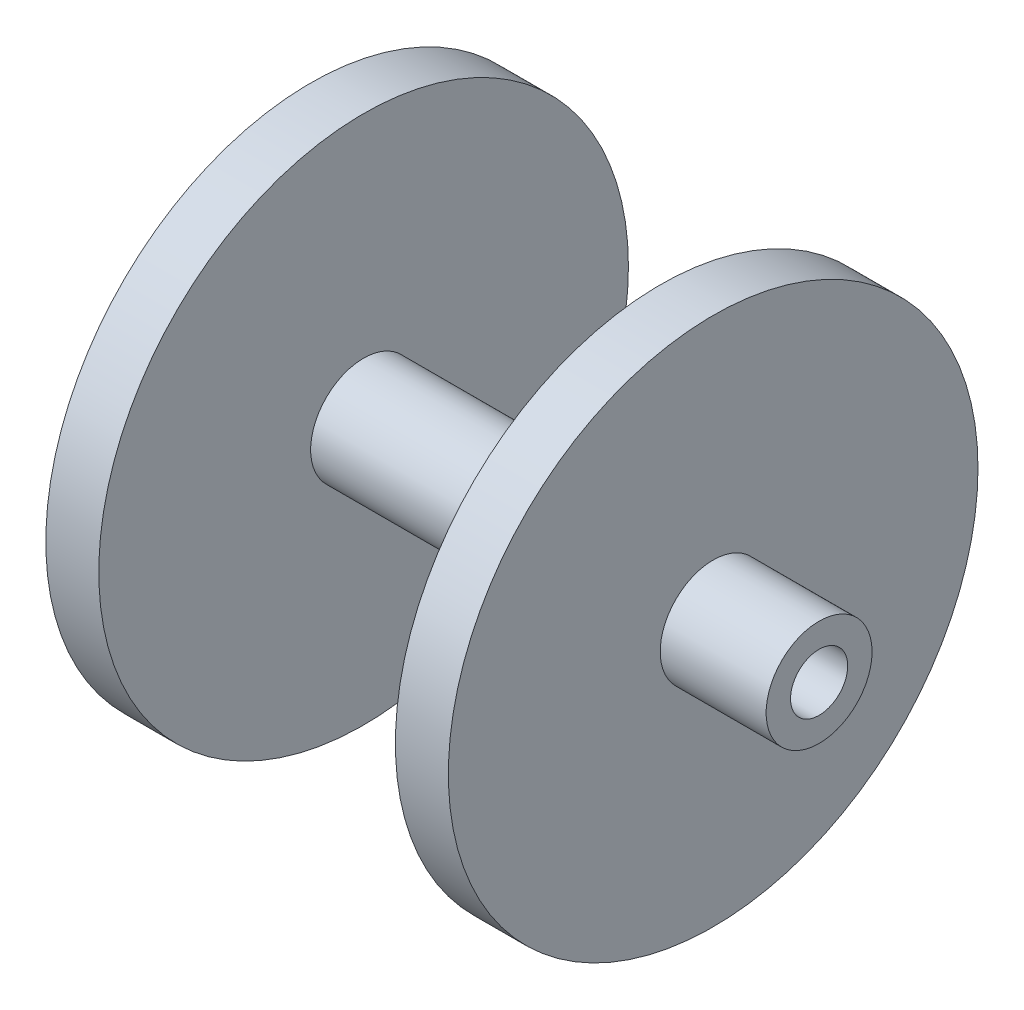
ISO-10303-21;
HEADER;
FILE_DESCRIPTION(('STEP AP214'),'2;1');
FILE_NAME('part.step','',(''),(''),'','','');
FILE_SCHEMA(('AUTOMOTIVE_DESIGN { 1 0 10303 214 1 1 1 1 }'));
ENDSEC;
DATA;
#1=APPLICATION_CONTEXT('core data for automotive mechanical design processes');
#2=APPLICATION_PROTOCOL_DEFINITION('international standard','automotive_design',2000,#1);
#3=PRODUCT_CONTEXT('',#1,'mechanical');
#4=PRODUCT('Part','Part','',(#3));
#5=PRODUCT_RELATED_PRODUCT_CATEGORY('part','',(#4));
#6=PRODUCT_DEFINITION_FORMATION('','',#4);
#7=PRODUCT_DEFINITION_CONTEXT('part definition',#1,'design');
#8=PRODUCT_DEFINITION('design','',#6,#7);
#9=PRODUCT_DEFINITION_SHAPE('','',#8);
#10=(LENGTH_UNIT() NAMED_UNIT(*) SI_UNIT(.MILLI.,.METRE.));
#11=(NAMED_UNIT(*) PLANE_ANGLE_UNIT() SI_UNIT($,.RADIAN.));
#12=(NAMED_UNIT(*) SI_UNIT($,.STERADIAN.) SOLID_ANGLE_UNIT());
#13=UNCERTAINTY_MEASURE_WITH_UNIT(LENGTH_MEASURE(1.E-05),#10,'distance_accuracy_value','');
#14=(GEOMETRIC_REPRESENTATION_CONTEXT(3) GLOBAL_UNCERTAINTY_ASSIGNED_CONTEXT((#13)) GLOBAL_UNIT_ASSIGNED_CONTEXT((#10,
#11,#12)) REPRESENTATION_CONTEXT('',''));
#15=CARTESIAN_POINT('',(0.,0.,0.));
#16=DIRECTION('',(0.,0.,1.));
#17=DIRECTION('',(1.,0.,0.));
#18=AXIS2_PLACEMENT_3D('',#15,#16,#17);
#19=CARTESIAN_POINT('',(-12.7,6.35,0.));
#20=DIRECTION('',(-1.,0.,0.));
#21=DIRECTION('',(0.,0.,1.));
#22=AXIS2_PLACEMENT_3D('',#19,#20,#21);
#23=PLANE('',#22);
#24=CARTESIAN_POINT('',(-12.7,0.,0.));
#25=DIRECTION('',(1.,0.,0.));
#26=DIRECTION('',(0.,0.,-1.));
#27=AXIS2_PLACEMENT_3D('',#24,#25,#26);
#28=CIRCLE('',#27,6.35);
#29=CARTESIAN_POINT('',(-12.7,0.,-6.35));
#30=VERTEX_POINT('',#29);
#31=EDGE_CURVE('E10',#30,#30,#28,.T.);
#32=ORIENTED_EDGE('',*,*,#31,.F.);
#33=EDGE_LOOP('',(#32));
#34=FACE_BOUND('',#33,.T.);
#35=ADVANCED_FACE('F37',(#34),#23,.T.);
#36=CARTESIAN_POINT('',(48.26,0.,0.));
#37=DIRECTION('',(1.,0.,0.));
#38=DIRECTION('',(0.,0.,-1.));
#39=AXIS2_PLACEMENT_3D('',#36,#37,#38);
#40=CYLINDRICAL_SURFACE('',#39,6.35);
#41=ORIENTED_EDGE('',*,*,#31,.T.);
#42=EDGE_LOOP('',(#41));
#43=FACE_BOUND('',#42,.T.);
#44=CARTESIAN_POINT('',(0.,0.,0.));
#45=DIRECTION('',(1.,0.,0.));
#46=DIRECTION('',(0.,0.,-1.));
#47=AXIS2_PLACEMENT_3D('',#44,#45,#46);
#48=CIRCLE('',#47,6.35000000000001);
#49=CARTESIAN_POINT('',(0.,0.,-6.35000000000001));
#50=VERTEX_POINT('',#49);
#51=EDGE_CURVE('E44',#50,#50,#48,.T.);
#52=ORIENTED_EDGE('',*,*,#51,.F.);
#53=EDGE_LOOP('',(#52));
#54=FACE_BOUND('',#53,.T.);
#55=ADVANCED_FACE('F119',(#43,#54),#40,.T.);
#56=CARTESIAN_POINT('',(0.,31.75,0.));
#57=DIRECTION('',(-1.,0.,0.));
#58=DIRECTION('',(0.,0.,1.));
#59=AXIS2_PLACEMENT_3D('',#56,#57,#58);
#60=PLANE('',#59);
#61=ORIENTED_EDGE('',*,*,#51,.T.);
#62=EDGE_LOOP('',(#61));
#63=FACE_BOUND('',#62,.T.);
#64=CARTESIAN_POINT('',(0.,0.,0.));
#65=DIRECTION('',(1.,0.,0.));
#66=DIRECTION('',(0.,0.,-1.));
#67=AXIS2_PLACEMENT_3D('',#64,#65,#66);
#68=CIRCLE('',#67,31.75);
#69=CARTESIAN_POINT('',(0.,0.,-31.75));
#70=VERTEX_POINT('',#69);
#71=EDGE_CURVE('E49',#70,#70,#68,.T.);
#72=ORIENTED_EDGE('',*,*,#71,.F.);
#73=EDGE_LOOP('',(#72));
#74=FACE_BOUND('',#73,.T.);
#75=ADVANCED_FACE('F124',(#63,#74),#60,.T.);
#76=CARTESIAN_POINT('',(48.26,0.,0.));
#77=DIRECTION('',(1.,0.,0.));
#78=DIRECTION('',(0.,0.,-1.));
#79=AXIS2_PLACEMENT_3D('',#76,#77,#78);
#80=CYLINDRICAL_SURFACE('',#79,31.75);
#81=ORIENTED_EDGE('',*,*,#71,.T.);
#82=EDGE_LOOP('',(#81));
#83=FACE_BOUND('',#82,.T.);
#84=CARTESIAN_POINT('',(6.35,0.,0.));
#85=DIRECTION('',(1.,0.,0.));
#86=DIRECTION('',(0.,0.,-1.));
#87=AXIS2_PLACEMENT_3D('',#84,#85,#86);
#88=CIRCLE('',#87,31.75);
#89=CARTESIAN_POINT('',(6.35,0.,-31.75));
#90=VERTEX_POINT('',#89);
#91=EDGE_CURVE('E54',#90,#90,#88,.T.);
#92=ORIENTED_EDGE('',*,*,#91,.F.);
#93=EDGE_LOOP('',(#92));
#94=FACE_BOUND('',#93,.T.);
#95=ADVANCED_FACE('F128',(#83,#94),#80,.T.);
#96=CARTESIAN_POINT('',(6.35,31.75,0.));
#97=DIRECTION('',(1.,0.,0.));
#98=DIRECTION('',(0.,0.,-1.));
#99=AXIS2_PLACEMENT_3D('',#96,#97,#98);
#100=PLANE('',#99);
#101=ORIENTED_EDGE('',*,*,#91,.T.);
#102=EDGE_LOOP('',(#101));
#103=FACE_BOUND('',#102,.T.);
#104=CARTESIAN_POINT('',(6.35,0.,0.));
#105=DIRECTION('',(1.,0.,0.));
#106=DIRECTION('',(0.,0.,-1.));
#107=AXIS2_PLACEMENT_3D('',#104,#105,#106);
#108=CIRCLE('',#107,6.35000000000001);
#109=CARTESIAN_POINT('',(6.35,0.,-6.35000000000001));
#110=VERTEX_POINT('',#109);
#111=EDGE_CURVE('E60',#110,#110,#108,.T.);
#112=ORIENTED_EDGE('',*,*,#111,.F.);
#113=EDGE_LOOP('',(#112));
#114=FACE_BOUND('',#113,.T.);
#115=ADVANCED_FACE('F134',(#103,#114),#100,.T.);
#116=CARTESIAN_POINT('',(48.26,0.,0.));
#117=DIRECTION('',(1.,0.,0.));
#118=DIRECTION('',(0.,0.,-1.));
#119=AXIS2_PLACEMENT_3D('',#116,#117,#118);
#120=CYLINDRICAL_SURFACE('',#119,6.35000000000001);
#121=ORIENTED_EDGE('',*,*,#111,.T.);
#122=EDGE_LOOP('',(#121));
#123=FACE_BOUND('',#122,.T.);
#124=CARTESIAN_POINT('',(41.91,0.,0.));
#125=DIRECTION('',(1.,0.,0.));
#126=DIRECTION('',(0.,0.,-1.));
#127=AXIS2_PLACEMENT_3D('',#124,#125,#126);
#128=CIRCLE('',#127,6.35000000000001);
#129=CARTESIAN_POINT('',(41.91,0.,-6.35000000000001));
#130=VERTEX_POINT('',#129);
#131=EDGE_CURVE('E64',#130,#130,#128,.T.);
#132=ORIENTED_EDGE('',*,*,#131,.F.);
#133=EDGE_LOOP('',(#132));
#134=FACE_BOUND('',#133,.T.);
#135=ADVANCED_FACE('F138',(#123,#134),#120,.T.);
#136=CARTESIAN_POINT('',(41.91,6.35000000000001,0.));
#137=DIRECTION('',(-1.,0.,0.));
#138=DIRECTION('',(0.,0.,1.));
#139=AXIS2_PLACEMENT_3D('',#136,#137,#138);
#140=PLANE('',#139);
#141=ORIENTED_EDGE('',*,*,#131,.T.);
#142=EDGE_LOOP('',(#141));
#143=FACE_BOUND('',#142,.T.);
#144=CARTESIAN_POINT('',(41.91,0.,0.));
#145=DIRECTION('',(1.,0.,0.));
#146=DIRECTION('',(0.,0.,-1.));
#147=AXIS2_PLACEMENT_3D('',#144,#145,#146);
#148=CIRCLE('',#147,31.75);
#149=CARTESIAN_POINT('',(41.91,0.,-31.75));
#150=VERTEX_POINT('',#149);
#151=EDGE_CURVE('E68',#150,#150,#148,.T.);
#152=ORIENTED_EDGE('',*,*,#151,.F.);
#153=EDGE_LOOP('',(#152));
#154=FACE_BOUND('',#153,.T.);
#155=ADVANCED_FACE('F142',(#143,#154),#140,.T.);
#156=CARTESIAN_POINT('',(48.26,0.,0.));
#157=DIRECTION('',(1.,0.,0.));
#158=DIRECTION('',(0.,0.,-1.));
#159=AXIS2_PLACEMENT_3D('',#156,#157,#158);
#160=CYLINDRICAL_SURFACE('',#159,31.75);
#161=ORIENTED_EDGE('',*,*,#151,.T.);
#162=EDGE_LOOP('',(#161));
#163=FACE_BOUND('',#162,.T.);
#164=CARTESIAN_POINT('',(48.26,0.,0.));
#165=DIRECTION('',(1.,0.,0.));
#166=DIRECTION('',(0.,0.,-1.));
#167=AXIS2_PLACEMENT_3D('',#164,#165,#166);
#168=CIRCLE('',#167,31.75);
#169=CARTESIAN_POINT('',(48.26,0.,-31.75));
#170=VERTEX_POINT('',#169);
#171=EDGE_CURVE('E72',#170,#170,#168,.T.);
#172=ORIENTED_EDGE('',*,*,#171,.F.);
#173=EDGE_LOOP('',(#172));
#174=FACE_BOUND('',#173,.T.);
#175=ADVANCED_FACE('F115',(#163,#174),#160,.T.);
#176=CARTESIAN_POINT('',(48.26,31.75,0.));
#177=DIRECTION('',(1.,0.,0.));
#178=DIRECTION('',(0.,0.,-1.));
#179=AXIS2_PLACEMENT_3D('',#176,#177,#178);
#180=PLANE('',#179);
#181=ORIENTED_EDGE('',*,*,#171,.T.);
#182=EDGE_LOOP('',(#181));
#183=FACE_BOUND('',#182,.T.);
#184=CARTESIAN_POINT('',(48.26,0.,0.));
#185=DIRECTION('',(1.,0.,0.));
#186=DIRECTION('',(0.,0.,-1.));
#187=AXIS2_PLACEMENT_3D('',#184,#185,#186);
#188=CIRCLE('',#187,6.35000000000003);
#189=CARTESIAN_POINT('',(48.26,0.,-6.35000000000003));
#190=VERTEX_POINT('',#189);
#191=EDGE_CURVE('E76',#190,#190,#188,.T.);
#192=ORIENTED_EDGE('',*,*,#191,.F.);
#193=EDGE_LOOP('',(#192));
#194=FACE_BOUND('',#193,.T.);
#195=ADVANCED_FACE('F109',(#183,#194),#180,.T.);
#196=CARTESIAN_POINT('',(48.26,0.,0.));
#197=DIRECTION('',(1.,0.,0.));
#198=DIRECTION('',(0.,0.,-1.));
#199=AXIS2_PLACEMENT_3D('',#196,#197,#198);
#200=CYLINDRICAL_SURFACE('',#199,6.35000000000003);
#201=ORIENTED_EDGE('',*,*,#191,.T.);
#202=EDGE_LOOP('',(#201));
#203=FACE_BOUND('',#202,.T.);
#204=CARTESIAN_POINT('',(60.96,0.,0.));
#205=DIRECTION('',(1.,0.,0.));
#206=DIRECTION('',(0.,0.,-1.));
#207=AXIS2_PLACEMENT_3D('',#204,#205,#206);
#208=CIRCLE('',#207,6.35000000000003);
#209=CARTESIAN_POINT('',(60.96,0.,-6.35000000000003));
#210=VERTEX_POINT('',#209);
#211=EDGE_CURVE('E80',#210,#210,#208,.T.);
#212=ORIENTED_EDGE('',*,*,#211,.F.);
#213=EDGE_LOOP('',(#212));
#214=FACE_BOUND('',#213,.T.);
#215=ADVANCED_FACE('F104',(#203,#214),#200,.T.);
#216=CARTESIAN_POINT('',(60.96,6.35000000000003,0.));
#217=DIRECTION('',(1.,0.,0.));
#218=DIRECTION('',(0.,0.,-1.));
#219=AXIS2_PLACEMENT_3D('',#216,#217,#218);
#220=PLANE('',#219);
#221=CARTESIAN_POINT('',(60.96,0.,0.));
#222=DIRECTION('',(1.,0.,0.));
#223=DIRECTION('',(0.,0.,-1.));
#224=AXIS2_PLACEMENT_3D('',#221,#222,#223);
#225=CIRCLE('',#224,3.429);
#226=CARTESIAN_POINT('',(60.96,0.,-3.429));
#227=VERTEX_POINT('',#226);
#228=EDGE_CURVE('E85',#227,#227,#225,.T.);
#229=ORIENTED_EDGE('',*,*,#228,.F.);
#230=EDGE_LOOP('',(#229));
#231=FACE_BOUND('',#230,.T.);
#232=ORIENTED_EDGE('',*,*,#211,.T.);
#233=EDGE_LOOP('',(#232));
#234=FACE_BOUND('',#233,.T.);
#235=ADVANCED_FACE('F98',(#231,#234),#220,.T.);
#236=CARTESIAN_POINT('',(55.245,0.,0.));
#237=DIRECTION('',(1.,0.,0.));
#238=DIRECTION('',(0.,0.,-1.));
#239=AXIS2_PLACEMENT_3D('',#236,#237,#238);
#240=CYLINDRICAL_SURFACE('',#239,3.429);
#241=CARTESIAN_POINT('',(55.245,0.,0.));
#242=DIRECTION('',(1.,0.,0.));
#243=DIRECTION('',(0.,0.,-1.));
#244=AXIS2_PLACEMENT_3D('',#241,#242,#243);
#245=CIRCLE('',#244,3.429);
#246=CARTESIAN_POINT('',(55.245,0.,-3.429));
#247=VERTEX_POINT('',#246);
#248=EDGE_CURVE('E84',#247,#247,#245,.T.);
#249=ORIENTED_EDGE('',*,*,#248,.F.);
#250=EDGE_LOOP('',(#249));
#251=FACE_BOUND('',#250,.T.);
#252=ORIENTED_EDGE('',*,*,#228,.T.);
#253=EDGE_LOOP('',(#252));
#254=FACE_BOUND('',#253,.T.);
#255=ADVANCED_FACE('F95',(#251,#254),#240,.F.);
#256=CARTESIAN_POINT('',(55.245,0.,0.));
#257=DIRECTION('',(1.,0.,0.));
#258=DIRECTION('',(0.,0.,-1.));
#259=AXIS2_PLACEMENT_3D('',#256,#257,#258);
#260=PLANE('',#259);
#261=ORIENTED_EDGE('',*,*,#248,.T.);
#262=EDGE_LOOP('',(#261));
#263=FACE_BOUND('',#262,.T.);
#264=ADVANCED_FACE('F93',(#263),#260,.T.);
#265=CLOSED_SHELL('',(#35,#55,#75,#95,#115,#135,#155,#175,#195,#215,#235,#255,#264));
#266=MANIFOLD_SOLID_BREP('B2',#265);
#267=ADVANCED_BREP_SHAPE_REPRESENTATION('',(#18,#266),#14);
#268=SHAPE_DEFINITION_REPRESENTATION(#9,#267);
ENDSEC;
END-ISO-10303-21;
